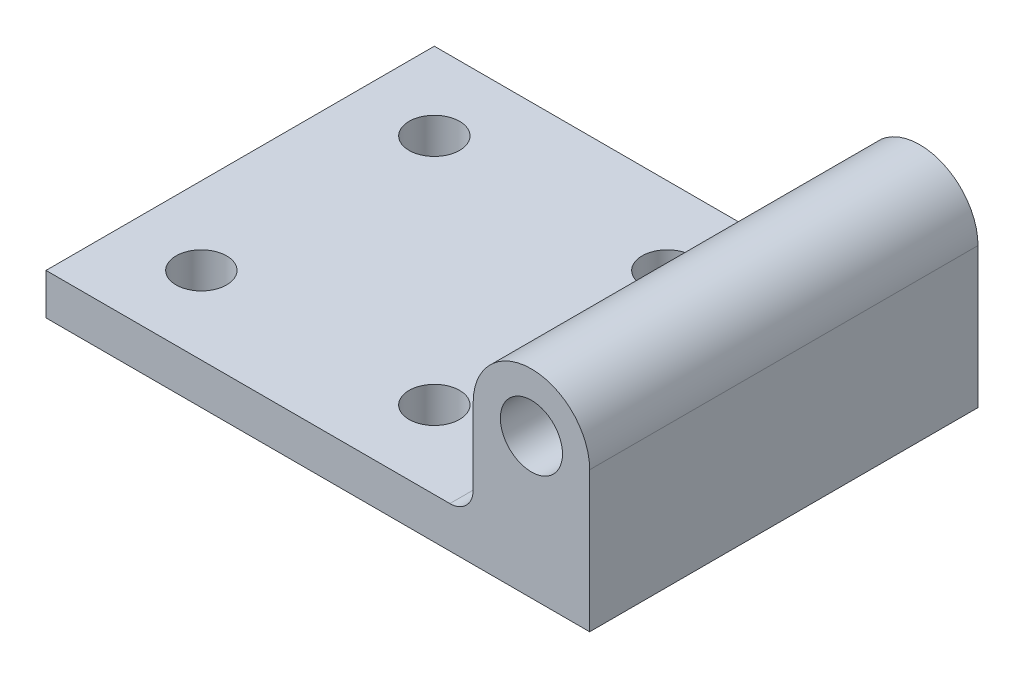
ISO-10303-21;
HEADER;
FILE_DESCRIPTION(('STEP AP214'),'2;1');
FILE_NAME('part.step','',(''),(''),'','','');
FILE_SCHEMA(('AUTOMOTIVE_DESIGN { 1 0 10303 214 1 1 1 1 }'));
ENDSEC;
DATA;
#1=APPLICATION_CONTEXT('core data for automotive mechanical design processes');
#2=APPLICATION_PROTOCOL_DEFINITION('international standard','automotive_design',2000,#1);
#3=PRODUCT_CONTEXT('',#1,'mechanical');
#4=PRODUCT('Part','Part','',(#3));
#5=PRODUCT_RELATED_PRODUCT_CATEGORY('part','',(#4));
#6=PRODUCT_DEFINITION_FORMATION('','',#4);
#7=PRODUCT_DEFINITION_CONTEXT('part definition',#1,'design');
#8=PRODUCT_DEFINITION('design','',#6,#7);
#9=PRODUCT_DEFINITION_SHAPE('','',#8);
#10=(LENGTH_UNIT() NAMED_UNIT(*) SI_UNIT(.MILLI.,.METRE.));
#11=(NAMED_UNIT(*) PLANE_ANGLE_UNIT() SI_UNIT($,.RADIAN.));
#12=(NAMED_UNIT(*) SI_UNIT($,.STERADIAN.) SOLID_ANGLE_UNIT());
#13=UNCERTAINTY_MEASURE_WITH_UNIT(LENGTH_MEASURE(1.E-05),#10,'distance_accuracy_value','');
#14=(GEOMETRIC_REPRESENTATION_CONTEXT(3) GLOBAL_UNCERTAINTY_ASSIGNED_CONTEXT((#13)) GLOBAL_UNIT_ASSIGNED_CONTEXT((#10,
#11,#12)) REPRESENTATION_CONTEXT('',''));
#15=CARTESIAN_POINT('',(0.,0.,0.));
#16=DIRECTION('',(0.,0.,1.));
#17=DIRECTION('',(1.,0.,0.));
#18=AXIS2_PLACEMENT_3D('',#15,#16,#17);
#19=CARTESIAN_POINT('',(0.,5.3,50.));
#20=DIRECTION('',(0.,0.,-1.));
#21=DIRECTION('',(-1.,0.,0.));
#22=AXIS2_PLACEMENT_3D('',#19,#20,#21);
#23=PLANE('',#22);
#24=DIRECTION('',(1.,0.,0.));
#25=VECTOR('',#24,1.);
#26=CARTESIAN_POINT('',(0.,0.,50.));
#27=LINE('',#26,#25);
#28=CARTESIAN_POINT('',(0.,0.,50.));
#29=VERTEX_POINT('',#28);
#30=CARTESIAN_POINT('',(70.,0.,50.));
#31=VERTEX_POINT('',#30);
#32=EDGE_CURVE('E100',#29,#31,#27,.T.);
#33=ORIENTED_EDGE('',*,*,#32,.T.);
#34=DIRECTION('',(0.,-1.,0.));
#35=VECTOR('',#34,1.);
#36=CARTESIAN_POINT('',(70.,5.3,50.));
#37=LINE('',#36,#35);
#38=CARTESIAN_POINT('',(70.,18.0714232440096,50.));
#39=VERTEX_POINT('',#38);
#40=EDGE_CURVE('E93',#39,#31,#37,.T.);
#41=ORIENTED_EDGE('',*,*,#40,.F.);
#42=CARTESIAN_POINT('',(62.5,18.0714232440096,50.));
#43=DIRECTION('',(0.,0.,1.));
#44=DIRECTION('',(1.,0.,0.));
#45=AXIS2_PLACEMENT_3D('',#42,#43,#44);
#46=CIRCLE('',#45,7.5);
#47=CARTESIAN_POINT('',(55.,18.0714232440096,50.));
#48=VERTEX_POINT('',#47);
#49=EDGE_CURVE('E97',#39,#48,#46,.T.);
#50=ORIENTED_EDGE('',*,*,#49,.T.);
#51=DIRECTION('',(0.,-1.,0.));
#52=VECTOR('',#51,1.);
#53=CARTESIAN_POINT('',(55.,18.0714232440096,50.));
#54=LINE('',#53,#52);
#55=CARTESIAN_POINT('',(55.,8.3,50.));
#56=VERTEX_POINT('',#55);
#57=EDGE_CURVE('E118',#48,#56,#54,.T.);
#58=ORIENTED_EDGE('',*,*,#57,.T.);
#59=CARTESIAN_POINT('',(52.,8.3,50.));
#60=DIRECTION('',(0.,0.,-1.));
#61=DIRECTION('',(-1.,0.,0.));
#62=AXIS2_PLACEMENT_3D('',#59,#60,#61);
#63=CIRCLE('',#62,3.);
#64=CARTESIAN_POINT('',(52.,5.3,50.));
#65=VERTEX_POINT('',#64);
#66=EDGE_CURVE('E42',#56,#65,#63,.T.);
#67=ORIENTED_EDGE('',*,*,#66,.T.);
#68=DIRECTION('',(1.,0.,0.));
#69=VECTOR('',#68,1.);
#70=CARTESIAN_POINT('',(0.,5.3,50.));
#71=LINE('',#70,#69);
#72=CARTESIAN_POINT('',(0.,5.3,50.));
#73=VERTEX_POINT('',#72);
#74=EDGE_CURVE('E147',#73,#65,#71,.T.);
#75=ORIENTED_EDGE('',*,*,#74,.F.);
#76=DIRECTION('',(0.,-1.,0.));
#77=VECTOR('',#76,1.);
#78=CARTESIAN_POINT('',(0.,5.3,50.));
#79=LINE('',#78,#77);
#80=EDGE_CURVE('E153',#73,#29,#79,.T.);
#81=ORIENTED_EDGE('',*,*,#80,.T.);
#82=EDGE_LOOP('',(#33,#41,#50,#58,#67,#75,#81));
#83=FACE_BOUND('',#82,.T.);
#84=CARTESIAN_POINT('',(62.5,18.0714232440096,50.));
#85=DIRECTION('',(0.,0.,1.));
#86=DIRECTION('',(1.,0.,0.));
#87=AXIS2_PLACEMENT_3D('',#84,#85,#86);
#88=CIRCLE('',#87,4.00000000000001);
#89=CARTESIAN_POINT('',(66.5,18.0714232440096,50.));
#90=VERTEX_POINT('',#89);
#91=EDGE_CURVE('E119',#90,#90,#88,.T.);
#92=ORIENTED_EDGE('',*,*,#91,.F.);
#93=EDGE_LOOP('',(#92));
#94=FACE_BOUND('',#93,.T.);
#95=ADVANCED_FACE('F34',(#83,#94),#23,.F.);
#96=CARTESIAN_POINT('',(70.,5.3,0.));
#97=DIRECTION('',(-1.,0.,0.));
#98=DIRECTION('',(0.,0.,1.));
#99=AXIS2_PLACEMENT_3D('',#96,#97,#98);
#100=PLANE('',#99);
#101=DIRECTION('',(0.,0.,-1.));
#102=VECTOR('',#101,1.);
#103=CARTESIAN_POINT('',(70.,0.,0.));
#104=LINE('',#103,#102);
#105=CARTESIAN_POINT('',(70.,0.,0.));
#106=VERTEX_POINT('',#105);
#107=EDGE_CURVE('E166',#31,#106,#104,.T.);
#108=ORIENTED_EDGE('',*,*,#107,.T.);
#109=DIRECTION('',(0.,-1.,0.));
#110=VECTOR('',#109,1.);
#111=CARTESIAN_POINT('',(70.,5.3,0.));
#112=LINE('',#111,#110);
#113=CARTESIAN_POINT('',(70.,18.0714232440096,0.));
#114=VERTEX_POINT('',#113);
#115=EDGE_CURVE('E104',#114,#106,#112,.T.);
#116=ORIENTED_EDGE('',*,*,#115,.F.);
#117=DIRECTION('',(0.,0.,1.));
#118=VECTOR('',#117,1.);
#119=CARTESIAN_POINT('',(70.,18.0714232440096,-25.2176644504953));
#120=LINE('',#119,#118);
#121=EDGE_CURVE('E107',#114,#39,#120,.T.);
#122=ORIENTED_EDGE('',*,*,#121,.T.);
#123=ORIENTED_EDGE('',*,*,#40,.T.);
#124=EDGE_LOOP('',(#108,#116,#122,#123));
#125=FACE_BOUND('',#124,.T.);
#126=ADVANCED_FACE('F108',(#125),#100,.F.);
#127=CARTESIAN_POINT('',(0.,5.3,0.));
#128=DIRECTION('',(0.,0.,-1.));
#129=DIRECTION('',(-1.,0.,0.));
#130=AXIS2_PLACEMENT_3D('',#127,#128,#129);
#131=PLANE('',#130);
#132=DIRECTION('',(1.,0.,0.));
#133=VECTOR('',#132,1.);
#134=CARTESIAN_POINT('',(0.,0.,0.));
#135=LINE('',#134,#133);
#136=CARTESIAN_POINT('',(0.,0.,0.));
#137=VERTEX_POINT('',#136);
#138=EDGE_CURVE('E168',#137,#106,#135,.T.);
#139=ORIENTED_EDGE('',*,*,#138,.F.);
#140=DIRECTION('',(0.,-1.,0.));
#141=VECTOR('',#140,1.);
#142=CARTESIAN_POINT('',(0.,5.3,0.));
#143=LINE('',#142,#141);
#144=CARTESIAN_POINT('',(0.,5.3,0.));
#145=VERTEX_POINT('',#144);
#146=EDGE_CURVE('E173',#145,#137,#143,.T.);
#147=ORIENTED_EDGE('',*,*,#146,.F.);
#148=DIRECTION('',(1.,0.,0.));
#149=VECTOR('',#148,1.);
#150=CARTESIAN_POINT('',(0.,5.3,0.));
#151=LINE('',#150,#149);
#152=CARTESIAN_POINT('',(52.,5.3,0.));
#153=VERTEX_POINT('',#152);
#154=EDGE_CURVE('E149',#145,#153,#151,.T.);
#155=ORIENTED_EDGE('',*,*,#154,.T.);
#156=CARTESIAN_POINT('',(52.,8.3,0.));
#157=DIRECTION('',(0.,0.,-1.));
#158=DIRECTION('',(-1.,0.,0.));
#159=AXIS2_PLACEMENT_3D('',#156,#157,#158);
#160=CIRCLE('',#159,3.);
#161=CARTESIAN_POINT('',(55.,8.3,0.));
#162=VERTEX_POINT('',#161);
#163=EDGE_CURVE('E11',#153,#162,#160,.F.);
#164=ORIENTED_EDGE('',*,*,#163,.T.);
#165=DIRECTION('',(0.,-1.,0.));
#166=VECTOR('',#165,1.);
#167=CARTESIAN_POINT('',(55.,18.0714232440096,0.));
#168=LINE('',#167,#166);
#169=CARTESIAN_POINT('',(55.,18.0714232440096,0.));
#170=VERTEX_POINT('',#169);
#171=EDGE_CURVE('E112',#170,#162,#168,.T.);
#172=ORIENTED_EDGE('',*,*,#171,.F.);
#173=CARTESIAN_POINT('',(62.5,18.0714232440096,0.));
#174=DIRECTION('',(0.,0.,-1.));
#175=DIRECTION('',(-1.,0.,0.));
#176=AXIS2_PLACEMENT_3D('',#173,#174,#175);
#177=CIRCLE('',#176,7.5);
#178=EDGE_CURVE('E131',#114,#170,#177,.F.);
#179=ORIENTED_EDGE('',*,*,#178,.F.);
#180=ORIENTED_EDGE('',*,*,#115,.T.);
#181=EDGE_LOOP('',(#139,#147,#155,#164,#172,#179,#180));
#182=FACE_BOUND('',#181,.T.);
#183=CARTESIAN_POINT('',(62.5,18.0714232440096,0.));
#184=DIRECTION('',(0.,0.,-1.));
#185=DIRECTION('',(-1.,0.,0.));
#186=AXIS2_PLACEMENT_3D('',#183,#184,#185);
#187=CIRCLE('',#186,4.00000000000001);
#188=CARTESIAN_POINT('',(58.5,18.0714232440096,0.));
#189=VERTEX_POINT('',#188);
#190=EDGE_CURVE('E121',#189,#189,#187,.F.);
#191=ORIENTED_EDGE('',*,*,#190,.T.);
#192=EDGE_LOOP('',(#191));
#193=FACE_BOUND('',#192,.T.);
#194=ADVANCED_FACE('F185',(#182,#193),#131,.T.);
#195=CARTESIAN_POINT('',(10.,5.3,10.));
#196=DIRECTION('',(0.,-1.,0.));
#197=DIRECTION('',(0.,0.,-1.));
#198=AXIS2_PLACEMENT_3D('',#195,#196,#197);
#199=CYLINDRICAL_SURFACE('',#198,3.25);
#200=CARTESIAN_POINT('',(10.,5.3,10.));
#201=DIRECTION('',(0.,1.,0.));
#202=DIRECTION('',(0.,0.,1.));
#203=AXIS2_PLACEMENT_3D('',#200,#201,#202);
#204=CIRCLE('',#203,3.25);
#205=CARTESIAN_POINT('',(10.,5.3,13.25));
#206=VERTEX_POINT('',#205);
#207=EDGE_CURVE('E144',#206,#206,#204,.T.);
#208=ORIENTED_EDGE('',*,*,#207,.T.);
#209=EDGE_LOOP('',(#208));
#210=FACE_BOUND('',#209,.T.);
#211=CARTESIAN_POINT('',(10.,0.,10.));
#212=DIRECTION('',(0.,1.,0.));
#213=DIRECTION('',(0.,0.,1.));
#214=AXIS2_PLACEMENT_3D('',#211,#212,#213);
#215=CIRCLE('',#214,3.25);
#216=CARTESIAN_POINT('',(10.,0.,13.25));
#217=VERTEX_POINT('',#216);
#218=EDGE_CURVE('E162',#217,#217,#215,.T.);
#219=ORIENTED_EDGE('',*,*,#218,.F.);
#220=EDGE_LOOP('',(#219));
#221=FACE_BOUND('',#220,.T.);
#222=ADVANCED_FACE('F215',(#210,#221),#199,.F.);
#223=CARTESIAN_POINT('',(40.,5.3,10.));
#224=DIRECTION('',(0.,-1.,0.));
#225=DIRECTION('',(0.,0.,-1.));
#226=AXIS2_PLACEMENT_3D('',#223,#224,#225);
#227=CYLINDRICAL_SURFACE('',#226,3.25);
#228=CARTESIAN_POINT('',(40.,5.3,10.));
#229=DIRECTION('',(0.,1.,0.));
#230=DIRECTION('',(0.,0.,1.));
#231=AXIS2_PLACEMENT_3D('',#228,#229,#230);
#232=CIRCLE('',#231,3.25);
#233=CARTESIAN_POINT('',(40.,5.3,13.25));
#234=VERTEX_POINT('',#233);
#235=EDGE_CURVE('E141',#234,#234,#232,.T.);
#236=ORIENTED_EDGE('',*,*,#235,.T.);
#237=EDGE_LOOP('',(#236));
#238=FACE_BOUND('',#237,.T.);
#239=CARTESIAN_POINT('',(40.,0.,10.));
#240=DIRECTION('',(0.,1.,0.));
#241=DIRECTION('',(0.,0.,1.));
#242=AXIS2_PLACEMENT_3D('',#239,#240,#241);
#243=CIRCLE('',#242,3.25);
#244=CARTESIAN_POINT('',(40.,0.,13.25));
#245=VERTEX_POINT('',#244);
#246=EDGE_CURVE('E159',#245,#245,#243,.T.);
#247=ORIENTED_EDGE('',*,*,#246,.F.);
#248=EDGE_LOOP('',(#247));
#249=FACE_BOUND('',#248,.T.);
#250=ADVANCED_FACE('F218',(#238,#249),#227,.F.);
#251=CARTESIAN_POINT('',(40.,5.3,40.));
#252=DIRECTION('',(0.,-1.,0.));
#253=DIRECTION('',(0.,0.,-1.));
#254=AXIS2_PLACEMENT_3D('',#251,#252,#253);
#255=CYLINDRICAL_SURFACE('',#254,3.25);
#256=CARTESIAN_POINT('',(40.,5.3,40.));
#257=DIRECTION('',(0.,1.,0.));
#258=DIRECTION('',(0.,0.,1.));
#259=AXIS2_PLACEMENT_3D('',#256,#257,#258);
#260=CIRCLE('',#259,3.25);
#261=CARTESIAN_POINT('',(40.,5.3,43.25));
#262=VERTEX_POINT('',#261);
#263=EDGE_CURVE('E137',#262,#262,#260,.T.);
#264=ORIENTED_EDGE('',*,*,#263,.T.);
#265=EDGE_LOOP('',(#264));
#266=FACE_BOUND('',#265,.T.);
#267=CARTESIAN_POINT('',(40.,0.,40.));
#268=DIRECTION('',(0.,1.,0.));
#269=DIRECTION('',(0.,0.,1.));
#270=AXIS2_PLACEMENT_3D('',#267,#268,#269);
#271=CIRCLE('',#270,3.25);
#272=CARTESIAN_POINT('',(40.,0.,43.25));
#273=VERTEX_POINT('',#272);
#274=EDGE_CURVE('E156',#273,#273,#271,.T.);
#275=ORIENTED_EDGE('',*,*,#274,.F.);
#276=EDGE_LOOP('',(#275));
#277=FACE_BOUND('',#276,.T.);
#278=ADVANCED_FACE('F222',(#266,#277),#255,.F.);
#279=CARTESIAN_POINT('',(10.,5.3,40.));
#280=DIRECTION('',(0.,-1.,0.));
#281=DIRECTION('',(0.,0.,-1.));
#282=AXIS2_PLACEMENT_3D('',#279,#280,#281);
#283=CYLINDRICAL_SURFACE('',#282,3.25);
#284=CARTESIAN_POINT('',(10.,5.3,40.));
#285=DIRECTION('',(0.,1.,0.));
#286=DIRECTION('',(0.,0.,1.));
#287=AXIS2_PLACEMENT_3D('',#284,#285,#286);
#288=CIRCLE('',#287,3.25);
#289=CARTESIAN_POINT('',(10.,5.3,43.25));
#290=VERTEX_POINT('',#289);
#291=EDGE_CURVE('E134',#290,#290,#288,.T.);
#292=ORIENTED_EDGE('',*,*,#291,.T.);
#293=EDGE_LOOP('',(#292));
#294=FACE_BOUND('',#293,.T.);
#295=CARTESIAN_POINT('',(10.,0.,40.));
#296=DIRECTION('',(0.,1.,0.));
#297=DIRECTION('',(0.,0.,1.));
#298=AXIS2_PLACEMENT_3D('',#295,#296,#297);
#299=CIRCLE('',#298,3.25);
#300=CARTESIAN_POINT('',(10.,0.,43.25));
#301=VERTEX_POINT('',#300);
#302=EDGE_CURVE('E128',#301,#301,#299,.T.);
#303=ORIENTED_EDGE('',*,*,#302,.F.);
#304=EDGE_LOOP('',(#303));
#305=FACE_BOUND('',#304,.T.);
#306=ADVANCED_FACE('F225',(#294,#305),#283,.F.);
#307=CARTESIAN_POINT('',(0.,5.3,0.));
#308=DIRECTION('',(1.,0.,0.));
#309=DIRECTION('',(0.,0.,-1.));
#310=AXIS2_PLACEMENT_3D('',#307,#308,#309);
#311=PLANE('',#310);
#312=DIRECTION('',(0.,0.,1.));
#313=VECTOR('',#312,1.);
#314=CARTESIAN_POINT('',(0.,0.,0.));
#315=LINE('',#314,#313);
#316=EDGE_CURVE('E138',#137,#29,#315,.T.);
#317=ORIENTED_EDGE('',*,*,#316,.T.);
#318=ORIENTED_EDGE('',*,*,#80,.F.);
#319=DIRECTION('',(0.,0.,1.));
#320=VECTOR('',#319,1.);
#321=CARTESIAN_POINT('',(0.,5.3,0.));
#322=LINE('',#321,#320);
#323=EDGE_CURVE('E151',#145,#73,#322,.T.);
#324=ORIENTED_EDGE('',*,*,#323,.F.);
#325=ORIENTED_EDGE('',*,*,#146,.T.);
#326=EDGE_LOOP('',(#317,#318,#324,#325));
#327=FACE_BOUND('',#326,.T.);
#328=ADVANCED_FACE('F192',(#327),#311,.F.);
#329=CARTESIAN_POINT('',(0.,5.3,0.));
#330=DIRECTION('',(0.,1.,0.));
#331=DIRECTION('',(0.,0.,1.));
#332=AXIS2_PLACEMENT_3D('',#329,#330,#331);
#333=PLANE('',#332);
#334=ORIENTED_EDGE('',*,*,#74,.T.);
#335=DIRECTION('',(0.,0.,1.));
#336=VECTOR('',#335,1.);
#337=CARTESIAN_POINT('',(52.,5.3,0.));
#338=LINE('',#337,#336);
#339=EDGE_CURVE('E55',#65,#153,#338,.F.);
#340=ORIENTED_EDGE('',*,*,#339,.T.);
#341=ORIENTED_EDGE('',*,*,#154,.F.);
#342=ORIENTED_EDGE('',*,*,#323,.T.);
#343=EDGE_LOOP('',(#334,#340,#341,#342));
#344=FACE_BOUND('',#343,.T.);
#345=ORIENTED_EDGE('',*,*,#291,.F.);
#346=EDGE_LOOP('',(#345));
#347=FACE_BOUND('',#346,.T.);
#348=ORIENTED_EDGE('',*,*,#263,.F.);
#349=EDGE_LOOP('',(#348));
#350=FACE_BOUND('',#349,.T.);
#351=ORIENTED_EDGE('',*,*,#235,.F.);
#352=EDGE_LOOP('',(#351));
#353=FACE_BOUND('',#352,.T.);
#354=ORIENTED_EDGE('',*,*,#207,.F.);
#355=EDGE_LOOP('',(#354));
#356=FACE_BOUND('',#355,.T.);
#357=ADVANCED_FACE('F188',(#344,#347,#350,#353,#356),#333,.T.);
#358=CARTESIAN_POINT('',(0.,0.,0.));
#359=DIRECTION('',(0.,1.,0.));
#360=DIRECTION('',(0.,0.,1.));
#361=AXIS2_PLACEMENT_3D('',#358,#359,#360);
#362=PLANE('',#361);
#363=ORIENTED_EDGE('',*,*,#302,.T.);
#364=EDGE_LOOP('',(#363));
#365=FACE_BOUND('',#364,.T.);
#366=ORIENTED_EDGE('',*,*,#274,.T.);
#367=EDGE_LOOP('',(#366));
#368=FACE_BOUND('',#367,.T.);
#369=ORIENTED_EDGE('',*,*,#246,.T.);
#370=EDGE_LOOP('',(#369));
#371=FACE_BOUND('',#370,.T.);
#372=ORIENTED_EDGE('',*,*,#218,.T.);
#373=EDGE_LOOP('',(#372));
#374=FACE_BOUND('',#373,.T.);
#375=ORIENTED_EDGE('',*,*,#32,.F.);
#376=ORIENTED_EDGE('',*,*,#316,.F.);
#377=ORIENTED_EDGE('',*,*,#138,.T.);
#378=ORIENTED_EDGE('',*,*,#107,.F.);
#379=EDGE_LOOP('',(#375,#376,#377,#378));
#380=FACE_BOUND('',#379,.T.);
#381=ADVANCED_FACE('F195',(#365,#368,#371,#374,#380),#362,.F.);
#382=CARTESIAN_POINT('',(62.5,18.0714232440096,-25.2176644504953));
#383=DIRECTION('',(0.,0.,1.));
#384=DIRECTION('',(1.,0.,0.));
#385=AXIS2_PLACEMENT_3D('',#382,#383,#384);
#386=CYLINDRICAL_SURFACE('',#385,7.5);
#387=ORIENTED_EDGE('',*,*,#121,.F.);
#388=ORIENTED_EDGE('',*,*,#178,.T.);
#389=DIRECTION('',(0.,0.,1.));
#390=VECTOR('',#389,1.);
#391=CARTESIAN_POINT('',(55.,18.0714232440096,-25.2176644504953));
#392=LINE('',#391,#390);
#393=EDGE_CURVE('E113',#170,#48,#392,.T.);
#394=ORIENTED_EDGE('',*,*,#393,.T.);
#395=ORIENTED_EDGE('',*,*,#49,.F.);
#396=EDGE_LOOP('',(#387,#388,#394,#395));
#397=FACE_BOUND('',#396,.T.);
#398=ADVANCED_FACE('F115',(#397),#386,.T.);
#399=CARTESIAN_POINT('',(55.,18.0714232440096,-25.2176644504953));
#400=DIRECTION('',(-1.,0.,0.));
#401=DIRECTION('',(0.,0.,1.));
#402=AXIS2_PLACEMENT_3D('',#399,#400,#401);
#403=PLANE('',#402);
#404=ORIENTED_EDGE('',*,*,#171,.T.);
#405=DIRECTION('',(0.,0.,1.));
#406=VECTOR('',#405,1.);
#407=CARTESIAN_POINT('',(55.,8.3,50.));
#408=LINE('',#407,#406);
#409=EDGE_CURVE('E103',#162,#56,#408,.T.);
#410=ORIENTED_EDGE('',*,*,#409,.T.);
#411=ORIENTED_EDGE('',*,*,#57,.F.);
#412=ORIENTED_EDGE('',*,*,#393,.F.);
#413=EDGE_LOOP('',(#404,#410,#411,#412));
#414=FACE_BOUND('',#413,.T.);
#415=ADVANCED_FACE('F180',(#414),#403,.T.);
#416=CARTESIAN_POINT('',(62.5,18.0714232440096,-25.2176644504953));
#417=DIRECTION('',(0.,0.,1.));
#418=DIRECTION('',(1.,0.,0.));
#419=AXIS2_PLACEMENT_3D('',#416,#417,#418);
#420=CYLINDRICAL_SURFACE('',#419,4.00000000000001);
#421=ORIENTED_EDGE('',*,*,#91,.T.);
#422=EDGE_LOOP('',(#421));
#423=FACE_BOUND('',#422,.T.);
#424=ORIENTED_EDGE('',*,*,#190,.F.);
#425=EDGE_LOOP('',(#424));
#426=FACE_BOUND('',#425,.T.);
#427=ADVANCED_FACE('F302',(#423,#426),#420,.F.);
#428=CARTESIAN_POINT('',(52.,8.3,-25.2176644504953));
#429=DIRECTION('',(0.,0.,-1.));
#430=DIRECTION('',(-1.,0.,0.));
#431=AXIS2_PLACEMENT_3D('',#428,#429,#430);
#432=CYLINDRICAL_SURFACE('',#431,3.);
#433=ORIENTED_EDGE('',*,*,#163,.F.);
#434=ORIENTED_EDGE('',*,*,#339,.F.);
#435=ORIENTED_EDGE('',*,*,#66,.F.);
#436=ORIENTED_EDGE('',*,*,#409,.F.);
#437=EDGE_LOOP('',(#433,#434,#435,#436));
#438=FACE_BOUND('',#437,.T.);
#439=ADVANCED_FACE('F36',(#438),#432,.F.);
#440=CLOSED_SHELL('',(#95,#126,#194,#222,#250,#278,#306,#328,#357,#381,#398,#415,#427,#439));
#441=MANIFOLD_SOLID_BREP('B2',#440);
#442=ADVANCED_BREP_SHAPE_REPRESENTATION('',(#18,#441),#14);
#443=SHAPE_DEFINITION_REPRESENTATION(#9,#442);
ENDSEC;
END-ISO-10303-21;
